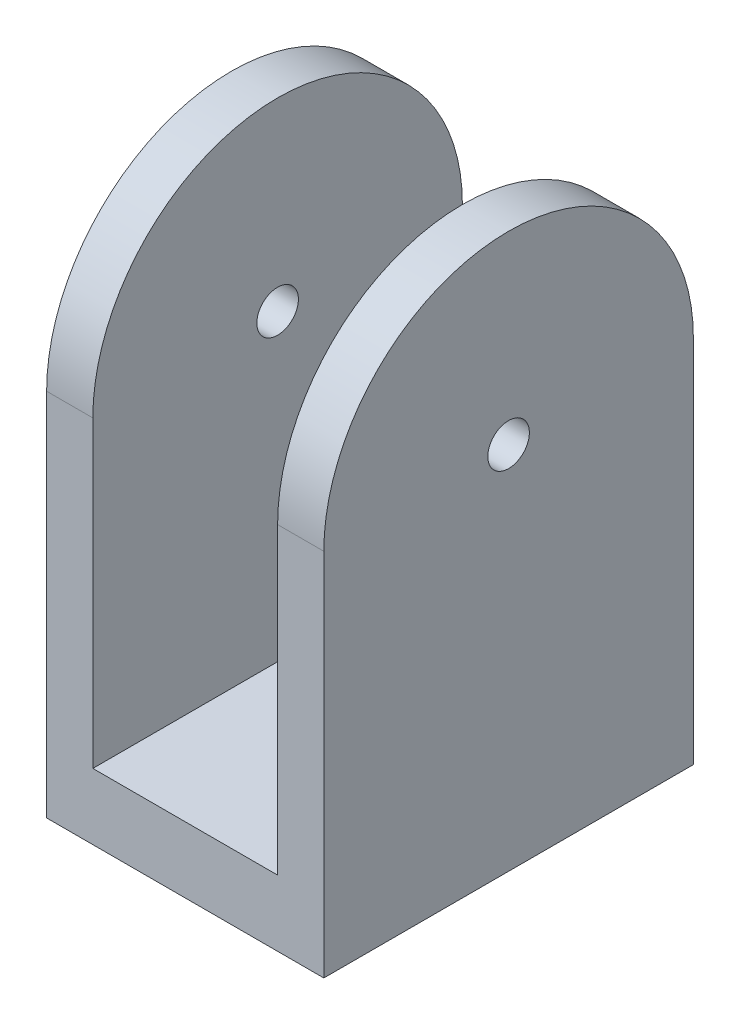
ISO-10303-21;
HEADER;
FILE_DESCRIPTION(('STEP AP214'),'2;1');
FILE_NAME('part.step','',(''),(''),'','','');
FILE_SCHEMA(('AUTOMOTIVE_DESIGN { 1 0 10303 214 1 1 1 1 }'));
ENDSEC;
DATA;
#1=APPLICATION_CONTEXT('core data for automotive mechanical design processes');
#2=APPLICATION_PROTOCOL_DEFINITION('international standard','automotive_design',2000,#1);
#3=PRODUCT_CONTEXT('',#1,'mechanical');
#4=PRODUCT('Part','Part','',(#3));
#5=PRODUCT_RELATED_PRODUCT_CATEGORY('part','',(#4));
#6=PRODUCT_DEFINITION_FORMATION('','',#4);
#7=PRODUCT_DEFINITION_CONTEXT('part definition',#1,'design');
#8=PRODUCT_DEFINITION('design','',#6,#7);
#9=PRODUCT_DEFINITION_SHAPE('','',#8);
#10=(LENGTH_UNIT() NAMED_UNIT(*) SI_UNIT(.MILLI.,.METRE.));
#11=(NAMED_UNIT(*) PLANE_ANGLE_UNIT() SI_UNIT($,.RADIAN.));
#12=(NAMED_UNIT(*) SI_UNIT($,.STERADIAN.) SOLID_ANGLE_UNIT());
#13=UNCERTAINTY_MEASURE_WITH_UNIT(LENGTH_MEASURE(1.E-05),#10,'distance_accuracy_value','');
#14=(GEOMETRIC_REPRESENTATION_CONTEXT(3) GLOBAL_UNCERTAINTY_ASSIGNED_CONTEXT((#13)) GLOBAL_UNIT_ASSIGNED_CONTEXT((#10,
#11,#12)) REPRESENTATION_CONTEXT('',''));
#15=CARTESIAN_POINT('',(0.,0.,0.));
#16=DIRECTION('',(0.,0.,1.));
#17=DIRECTION('',(1.,0.,0.));
#18=AXIS2_PLACEMENT_3D('',#15,#16,#17);
#19=CARTESIAN_POINT('',(30.,40.,0.));
#20=DIRECTION('',(-1.,0.,0.));
#21=DIRECTION('',(0.,0.,1.));
#22=AXIS2_PLACEMENT_3D('',#19,#20,#21);
#23=CYLINDRICAL_SURFACE('',#22,20.);
#24=DIRECTION('',(-1.,0.,0.));
#25=VECTOR('',#24,1.);
#26=CARTESIAN_POINT('',(30.,40.,20.));
#27=LINE('',#26,#25);
#28=CARTESIAN_POINT('',(5.,40.,20.));
#29=VERTEX_POINT('',#28);
#30=CARTESIAN_POINT('',(0.,40.,20.));
#31=VERTEX_POINT('',#30);
#32=EDGE_CURVE('E80',#29,#31,#27,.T.);
#33=ORIENTED_EDGE('',*,*,#32,.F.);
#34=CARTESIAN_POINT('',(5.,40.,0.));
#35=DIRECTION('',(-1.,0.,0.));
#36=DIRECTION('',(0.,0.,1.));
#37=AXIS2_PLACEMENT_3D('',#34,#35,#36);
#38=CIRCLE('',#37,20.);
#39=CARTESIAN_POINT('',(5.,40.,-20.));
#40=VERTEX_POINT('',#39);
#41=EDGE_CURVE('E41',#29,#40,#38,.T.);
#42=ORIENTED_EDGE('',*,*,#41,.T.);
#43=DIRECTION('',(-1.,0.,0.));
#44=VECTOR('',#43,1.);
#45=CARTESIAN_POINT('',(30.,40.,-20.));
#46=LINE('',#45,#44);
#47=CARTESIAN_POINT('',(0.,40.,-20.));
#48=VERTEX_POINT('',#47);
#49=EDGE_CURVE('E149',#40,#48,#46,.T.);
#50=ORIENTED_EDGE('',*,*,#49,.T.);
#51=CARTESIAN_POINT('',(0.,40.,0.));
#52=DIRECTION('',(1.,0.,0.));
#53=DIRECTION('',(0.,0.,1.));
#54=AXIS2_PLACEMENT_3D('',#51,#52,#53);
#55=CIRCLE('',#54,20.);
#56=EDGE_CURVE('E136',#48,#31,#55,.T.);
#57=ORIENTED_EDGE('',*,*,#56,.T.);
#58=EDGE_LOOP('',(#33,#42,#50,#57));
#59=FACE_BOUND('',#58,.T.);
#60=ADVANCED_FACE('F32',(#59),#23,.T.);
#61=CARTESIAN_POINT('',(30.,0.,20.));
#62=DIRECTION('',(0.,0.,-1.));
#63=DIRECTION('',(-1.,0.,0.));
#64=AXIS2_PLACEMENT_3D('',#61,#62,#63);
#65=PLANE('',#64);
#66=DIRECTION('',(1.,0.,0.));
#67=VECTOR('',#66,1.);
#68=CARTESIAN_POINT('',(30.,7.14483321708326,20.));
#69=LINE('',#68,#67);
#70=CARTESIAN_POINT('',(5.,7.14483321708326,20.));
#71=VERTEX_POINT('',#70);
#72=CARTESIAN_POINT('',(25.,7.14483321708326,20.));
#73=VERTEX_POINT('',#72);
#74=EDGE_CURVE('E111',#71,#73,#69,.T.);
#75=ORIENTED_EDGE('',*,*,#74,.F.);
#76=DIRECTION('',(0.,1.,0.));
#77=VECTOR('',#76,1.);
#78=CARTESIAN_POINT('',(5.,0.,20.));
#79=LINE('',#78,#77);
#80=EDGE_CURVE('E118',#71,#29,#79,.T.);
#81=ORIENTED_EDGE('',*,*,#80,.T.);
#82=ORIENTED_EDGE('',*,*,#32,.T.);
#83=DIRECTION('',(0.,-1.,0.));
#84=VECTOR('',#83,1.);
#85=CARTESIAN_POINT('',(0.,0.,20.));
#86=LINE('',#85,#84);
#87=CARTESIAN_POINT('',(0.,0.,20.));
#88=VERTEX_POINT('',#87);
#89=EDGE_CURVE('E117',#31,#88,#86,.T.);
#90=ORIENTED_EDGE('',*,*,#89,.T.);
#91=DIRECTION('',(-1.,0.,0.));
#92=VECTOR('',#91,1.);
#93=CARTESIAN_POINT('',(30.,0.,20.));
#94=LINE('',#93,#92);
#95=CARTESIAN_POINT('',(30.,0.,20.));
#96=VERTEX_POINT('',#95);
#97=EDGE_CURVE('E156',#96,#88,#94,.T.);
#98=ORIENTED_EDGE('',*,*,#97,.F.);
#99=DIRECTION('',(0.,-1.,0.));
#100=VECTOR('',#99,1.);
#101=CARTESIAN_POINT('',(30.,0.,20.));
#102=LINE('',#101,#100);
#103=CARTESIAN_POINT('',(30.,40.,20.));
#104=VERTEX_POINT('',#103);
#105=EDGE_CURVE('E134',#104,#96,#102,.T.);
#106=ORIENTED_EDGE('',*,*,#105,.F.);
#107=CARTESIAN_POINT('',(25.,40.,20.));
#108=VERTEX_POINT('',#107);
#109=EDGE_CURVE('E126',#104,#108,#27,.T.);
#110=ORIENTED_EDGE('',*,*,#109,.T.);
#111=DIRECTION('',(0.,-1.,0.));
#112=VECTOR('',#111,1.);
#113=CARTESIAN_POINT('',(25.,0.,20.));
#114=LINE('',#113,#112);
#115=EDGE_CURVE('E49',#108,#73,#114,.T.);
#116=ORIENTED_EDGE('',*,*,#115,.T.);
#117=EDGE_LOOP('',(#75,#81,#82,#90,#98,#106,#110,#116));
#118=FACE_BOUND('',#117,.T.);
#119=ADVANCED_FACE('F34',(#118),#65,.F.);
#120=CARTESIAN_POINT('',(30.,0.,-20.));
#121=DIRECTION('',(0.,1.,0.));
#122=DIRECTION('',(0.,0.,1.));
#123=AXIS2_PLACEMENT_3D('',#120,#121,#122);
#124=PLANE('',#123);
#125=CARTESIAN_POINT('',(15.,0.,0.));
#126=DIRECTION('',(0.,-1.,0.));
#127=DIRECTION('',(0.,0.,-1.));
#128=AXIS2_PLACEMENT_3D('',#125,#126,#127);
#129=CIRCLE('',#128,2.25);
#130=CARTESIAN_POINT('',(15.,0.,-2.25));
#131=VERTEX_POINT('',#130);
#132=EDGE_CURVE('E163',#131,#131,#129,.T.);
#133=ORIENTED_EDGE('',*,*,#132,.F.);
#134=EDGE_LOOP('',(#133));
#135=FACE_BOUND('',#134,.T.);
#136=DIRECTION('',(0.,0.,-1.));
#137=VECTOR('',#136,1.);
#138=CARTESIAN_POINT('',(0.,0.,-20.));
#139=LINE('',#138,#137);
#140=CARTESIAN_POINT('',(0.,0.,-20.));
#141=VERTEX_POINT('',#140);
#142=EDGE_CURVE('E142',#88,#141,#139,.T.);
#143=ORIENTED_EDGE('',*,*,#142,.T.);
#144=DIRECTION('',(-1.,0.,0.));
#145=VECTOR('',#144,1.);
#146=CARTESIAN_POINT('',(30.,0.,-20.));
#147=LINE('',#146,#145);
#148=CARTESIAN_POINT('',(30.,0.,-20.));
#149=VERTEX_POINT('',#148);
#150=EDGE_CURVE('E153',#149,#141,#147,.T.);
#151=ORIENTED_EDGE('',*,*,#150,.F.);
#152=DIRECTION('',(0.,0.,-1.));
#153=VECTOR('',#152,1.);
#154=CARTESIAN_POINT('',(30.,0.,-20.));
#155=LINE('',#154,#153);
#156=EDGE_CURVE('E88',#96,#149,#155,.T.);
#157=ORIENTED_EDGE('',*,*,#156,.F.);
#158=ORIENTED_EDGE('',*,*,#97,.T.);
#159=EDGE_LOOP('',(#143,#151,#157,#158));
#160=FACE_BOUND('',#159,.T.);
#161=ADVANCED_FACE('F205',(#135,#160),#124,.F.);
#162=CARTESIAN_POINT('',(30.,0.,-20.));
#163=DIRECTION('',(0.,0.,1.));
#164=DIRECTION('',(1.,0.,0.));
#165=AXIS2_PLACEMENT_3D('',#162,#163,#164);
#166=PLANE('',#165);
#167=ORIENTED_EDGE('',*,*,#49,.F.);
#168=DIRECTION('',(0.,-1.,0.));
#169=VECTOR('',#168,1.);
#170=CARTESIAN_POINT('',(5.,0.,-20.));
#171=LINE('',#170,#169);
#172=CARTESIAN_POINT('',(5.,7.14483321708326,-20.));
#173=VERTEX_POINT('',#172);
#174=EDGE_CURVE('E127',#40,#173,#171,.T.);
#175=ORIENTED_EDGE('',*,*,#174,.T.);
#176=DIRECTION('',(-1.,0.,0.));
#177=VECTOR('',#176,1.);
#178=CARTESIAN_POINT('',(30.,7.14483321708326,-20.));
#179=LINE('',#178,#177);
#180=CARTESIAN_POINT('',(25.,7.14483321708326,-20.));
#181=VERTEX_POINT('',#180);
#182=EDGE_CURVE('E11',#181,#173,#179,.T.);
#183=ORIENTED_EDGE('',*,*,#182,.F.);
#184=DIRECTION('',(0.,1.,0.));
#185=VECTOR('',#184,1.);
#186=CARTESIAN_POINT('',(25.,0.,-20.));
#187=LINE('',#186,#185);
#188=CARTESIAN_POINT('',(25.,40.,-20.));
#189=VERTEX_POINT('',#188);
#190=EDGE_CURVE('E122',#181,#189,#187,.T.);
#191=ORIENTED_EDGE('',*,*,#190,.T.);
#192=CARTESIAN_POINT('',(30.,40.,-20.));
#193=VERTEX_POINT('',#192);
#194=EDGE_CURVE('E150',#193,#189,#46,.T.);
#195=ORIENTED_EDGE('',*,*,#194,.F.);
#196=DIRECTION('',(0.,1.,0.));
#197=VECTOR('',#196,1.);
#198=CARTESIAN_POINT('',(30.,0.,-20.));
#199=LINE('',#198,#197);
#200=EDGE_CURVE('E138',#149,#193,#199,.T.);
#201=ORIENTED_EDGE('',*,*,#200,.F.);
#202=ORIENTED_EDGE('',*,*,#150,.T.);
#203=DIRECTION('',(0.,1.,0.));
#204=VECTOR('',#203,1.);
#205=CARTESIAN_POINT('',(0.,0.,-20.));
#206=LINE('',#205,#204);
#207=EDGE_CURVE('E144',#141,#48,#206,.T.);
#208=ORIENTED_EDGE('',*,*,#207,.T.);
#209=EDGE_LOOP('',(#167,#175,#183,#191,#195,#201,#202,#208));
#210=FACE_BOUND('',#209,.T.);
#211=ADVANCED_FACE('F210',(#210),#166,.F.);
#212=ORIENTED_EDGE('',*,*,#194,.T.);
#213=CARTESIAN_POINT('',(25.,40.,0.));
#214=DIRECTION('',(1.,0.,0.));
#215=DIRECTION('',(0.,0.,-1.));
#216=AXIS2_PLACEMENT_3D('',#213,#214,#215);
#217=CIRCLE('',#216,20.);
#218=EDGE_CURVE('E158',#189,#108,#217,.T.);
#219=ORIENTED_EDGE('',*,*,#218,.T.);
#220=ORIENTED_EDGE('',*,*,#109,.F.);
#221=CARTESIAN_POINT('',(30.,40.,0.));
#222=DIRECTION('',(1.,0.,0.));
#223=DIRECTION('',(0.,0.,1.));
#224=AXIS2_PLACEMENT_3D('',#221,#222,#223);
#225=CIRCLE('',#224,20.);
#226=EDGE_CURVE('E58',#193,#104,#225,.T.);
#227=ORIENTED_EDGE('',*,*,#226,.F.);
#228=EDGE_LOOP('',(#212,#219,#220,#227));
#229=FACE_BOUND('',#228,.T.);
#230=ADVANCED_FACE('F201',(#229),#23,.T.);
#231=CARTESIAN_POINT('',(30.,40.,0.));
#232=DIRECTION('',(-1.,0.,0.));
#233=DIRECTION('',(0.,0.,1.));
#234=AXIS2_PLACEMENT_3D('',#231,#232,#233);
#235=PLANE('',#234);
#236=CARTESIAN_POINT('',(30.,40.,0.));
#237=DIRECTION('',(1.,0.,0.));
#238=DIRECTION('',(0.,0.,-1.));
#239=AXIS2_PLACEMENT_3D('',#236,#237,#238);
#240=CIRCLE('',#239,2.25);
#241=CARTESIAN_POINT('',(30.,40.,-2.25));
#242=VERTEX_POINT('',#241);
#243=EDGE_CURVE('E175',#242,#242,#240,.T.);
#244=ORIENTED_EDGE('',*,*,#243,.F.);
#245=EDGE_LOOP('',(#244));
#246=FACE_BOUND('',#245,.T.);
#247=ORIENTED_EDGE('',*,*,#105,.T.);
#248=ORIENTED_EDGE('',*,*,#156,.T.);
#249=ORIENTED_EDGE('',*,*,#200,.T.);
#250=ORIENTED_EDGE('',*,*,#226,.T.);
#251=EDGE_LOOP('',(#247,#248,#249,#250));
#252=FACE_BOUND('',#251,.T.);
#253=ADVANCED_FACE('F209',(#246,#252),#235,.F.);
#254=CARTESIAN_POINT('',(0.,40.,0.));
#255=DIRECTION('',(-1.,0.,0.));
#256=DIRECTION('',(0.,0.,1.));
#257=AXIS2_PLACEMENT_3D('',#254,#255,#256);
#258=PLANE('',#257);
#259=CARTESIAN_POINT('',(0.,40.,0.));
#260=DIRECTION('',(1.,0.,0.));
#261=DIRECTION('',(0.,0.,-1.));
#262=AXIS2_PLACEMENT_3D('',#259,#260,#261);
#263=CIRCLE('',#262,2.25);
#264=CARTESIAN_POINT('',(0.,40.,-2.25));
#265=VERTEX_POINT('',#264);
#266=EDGE_CURVE('E178',#265,#265,#263,.T.);
#267=ORIENTED_EDGE('',*,*,#266,.T.);
#268=EDGE_LOOP('',(#267));
#269=FACE_BOUND('',#268,.T.);
#270=ORIENTED_EDGE('',*,*,#89,.F.);
#271=ORIENTED_EDGE('',*,*,#56,.F.);
#272=ORIENTED_EDGE('',*,*,#207,.F.);
#273=ORIENTED_EDGE('',*,*,#142,.F.);
#274=EDGE_LOOP('',(#270,#271,#272,#273));
#275=FACE_BOUND('',#274,.T.);
#276=ADVANCED_FACE('F216',(#269,#275),#258,.T.);
#277=CARTESIAN_POINT('',(0.,7.14483321708326,0.));
#278=DIRECTION('',(0.,1.,0.));
#279=DIRECTION('',(0.,0.,1.));
#280=AXIS2_PLACEMENT_3D('',#277,#278,#279);
#281=PLANE('',#280);
#282=CARTESIAN_POINT('',(15.,7.14483321708326,0.));
#283=DIRECTION('',(0.,1.,0.));
#284=DIRECTION('',(0.,0.,1.));
#285=AXIS2_PLACEMENT_3D('',#282,#283,#284);
#286=CIRCLE('',#285,2.25);
#287=CARTESIAN_POINT('',(15.,7.14483321708326,2.25));
#288=VERTEX_POINT('',#287);
#289=EDGE_CURVE('E161',#288,#288,#286,.T.);
#290=ORIENTED_EDGE('',*,*,#289,.F.);
#291=EDGE_LOOP('',(#290));
#292=FACE_BOUND('',#291,.T.);
#293=ORIENTED_EDGE('',*,*,#74,.T.);
#294=DIRECTION('',(0.,0.,-1.));
#295=VECTOR('',#294,1.);
#296=CARTESIAN_POINT('',(25.,7.14483321708326,100.));
#297=LINE('',#296,#295);
#298=EDGE_CURVE('E113',#73,#181,#297,.T.);
#299=ORIENTED_EDGE('',*,*,#298,.T.);
#300=ORIENTED_EDGE('',*,*,#182,.T.);
#301=DIRECTION('',(0.,0.,1.));
#302=VECTOR('',#301,1.);
#303=CARTESIAN_POINT('',(5.,7.14483321708326,100.));
#304=LINE('',#303,#302);
#305=EDGE_CURVE('E116',#173,#71,#304,.T.);
#306=ORIENTED_EDGE('',*,*,#305,.T.);
#307=EDGE_LOOP('',(#293,#299,#300,#306));
#308=FACE_BOUND('',#307,.T.);
#309=ADVANCED_FACE('F112',(#292,#308),#281,.T.);
#310=CARTESIAN_POINT('',(5.,7.14483321708326,100.));
#311=DIRECTION('',(-1.,0.,0.));
#312=DIRECTION('',(0.,0.,1.));
#313=AXIS2_PLACEMENT_3D('',#310,#311,#312);
#314=PLANE('',#313);
#315=CARTESIAN_POINT('',(5.,40.,0.));
#316=DIRECTION('',(-1.,0.,0.));
#317=DIRECTION('',(0.,0.,1.));
#318=AXIS2_PLACEMENT_3D('',#315,#316,#317);
#319=CIRCLE('',#318,2.25);
#320=CARTESIAN_POINT('',(5.,40.,2.25));
#321=VERTEX_POINT('',#320);
#322=EDGE_CURVE('E168',#321,#321,#319,.T.);
#323=ORIENTED_EDGE('',*,*,#322,.T.);
#324=EDGE_LOOP('',(#323));
#325=FACE_BOUND('',#324,.T.);
#326=ORIENTED_EDGE('',*,*,#305,.F.);
#327=ORIENTED_EDGE('',*,*,#174,.F.);
#328=ORIENTED_EDGE('',*,*,#41,.F.);
#329=ORIENTED_EDGE('',*,*,#80,.F.);
#330=EDGE_LOOP('',(#326,#327,#328,#329));
#331=FACE_BOUND('',#330,.T.);
#332=ADVANCED_FACE('F224',(#325,#331),#314,.F.);
#333=CARTESIAN_POINT('',(25.,7.14483321708326,100.));
#334=DIRECTION('',(1.,0.,0.));
#335=DIRECTION('',(0.,0.,-1.));
#336=AXIS2_PLACEMENT_3D('',#333,#334,#335);
#337=PLANE('',#336);
#338=CARTESIAN_POINT('',(25.,40.,0.));
#339=DIRECTION('',(1.,0.,0.));
#340=DIRECTION('',(0.,0.,-1.));
#341=AXIS2_PLACEMENT_3D('',#338,#339,#340);
#342=CIRCLE('',#341,2.25);
#343=CARTESIAN_POINT('',(25.,40.,-2.25));
#344=VERTEX_POINT('',#343);
#345=EDGE_CURVE('E36',#344,#344,#342,.T.);
#346=ORIENTED_EDGE('',*,*,#345,.T.);
#347=EDGE_LOOP('',(#346));
#348=FACE_BOUND('',#347,.T.);
#349=ORIENTED_EDGE('',*,*,#218,.F.);
#350=ORIENTED_EDGE('',*,*,#190,.F.);
#351=ORIENTED_EDGE('',*,*,#298,.F.);
#352=ORIENTED_EDGE('',*,*,#115,.F.);
#353=EDGE_LOOP('',(#349,#350,#351,#352));
#354=FACE_BOUND('',#353,.T.);
#355=ADVANCED_FACE('F120',(#348,#354),#337,.F.);
#356=CARTESIAN_POINT('',(15.,60.,0.));
#357=DIRECTION('',(0.,-1.,0.));
#358=DIRECTION('',(0.,0.,-1.));
#359=AXIS2_PLACEMENT_3D('',#356,#357,#358);
#360=CYLINDRICAL_SURFACE('',#359,2.25);
#361=ORIENTED_EDGE('',*,*,#289,.T.);
#362=EDGE_LOOP('',(#361));
#363=FACE_BOUND('',#362,.T.);
#364=ORIENTED_EDGE('',*,*,#132,.T.);
#365=EDGE_LOOP('',(#364));
#366=FACE_BOUND('',#365,.T.);
#367=ADVANCED_FACE('F189',(#363,#366),#360,.F.);
#368=CARTESIAN_POINT('',(0.,40.,0.));
#369=DIRECTION('',(1.,0.,0.));
#370=DIRECTION('',(0.,0.,-1.));
#371=AXIS2_PLACEMENT_3D('',#368,#369,#370);
#372=CYLINDRICAL_SURFACE('',#371,2.25);
#373=ORIENTED_EDGE('',*,*,#243,.T.);
#374=EDGE_LOOP('',(#373));
#375=FACE_BOUND('',#374,.T.);
#376=ORIENTED_EDGE('',*,*,#345,.F.);
#377=EDGE_LOOP('',(#376));
#378=FACE_BOUND('',#377,.T.);
#379=ADVANCED_FACE('F186',(#375,#378),#372,.F.);
#380=ORIENTED_EDGE('',*,*,#266,.F.);
#381=EDGE_LOOP('',(#380));
#382=FACE_BOUND('',#381,.T.);
#383=ORIENTED_EDGE('',*,*,#322,.F.);
#384=EDGE_LOOP('',(#383));
#385=FACE_BOUND('',#384,.T.);
#386=ADVANCED_FACE('F188',(#382,#385),#372,.F.);
#387=CLOSED_SHELL('',(#60,#119,#161,#211,#230,#253,#276,#309,#332,#355,#367,#379,#386));
#388=MANIFOLD_SOLID_BREP('B2',#387);
#389=ADVANCED_BREP_SHAPE_REPRESENTATION('',(#18,#388),#14);
#390=SHAPE_DEFINITION_REPRESENTATION(#9,#389);
ENDSEC;
END-ISO-10303-21;
